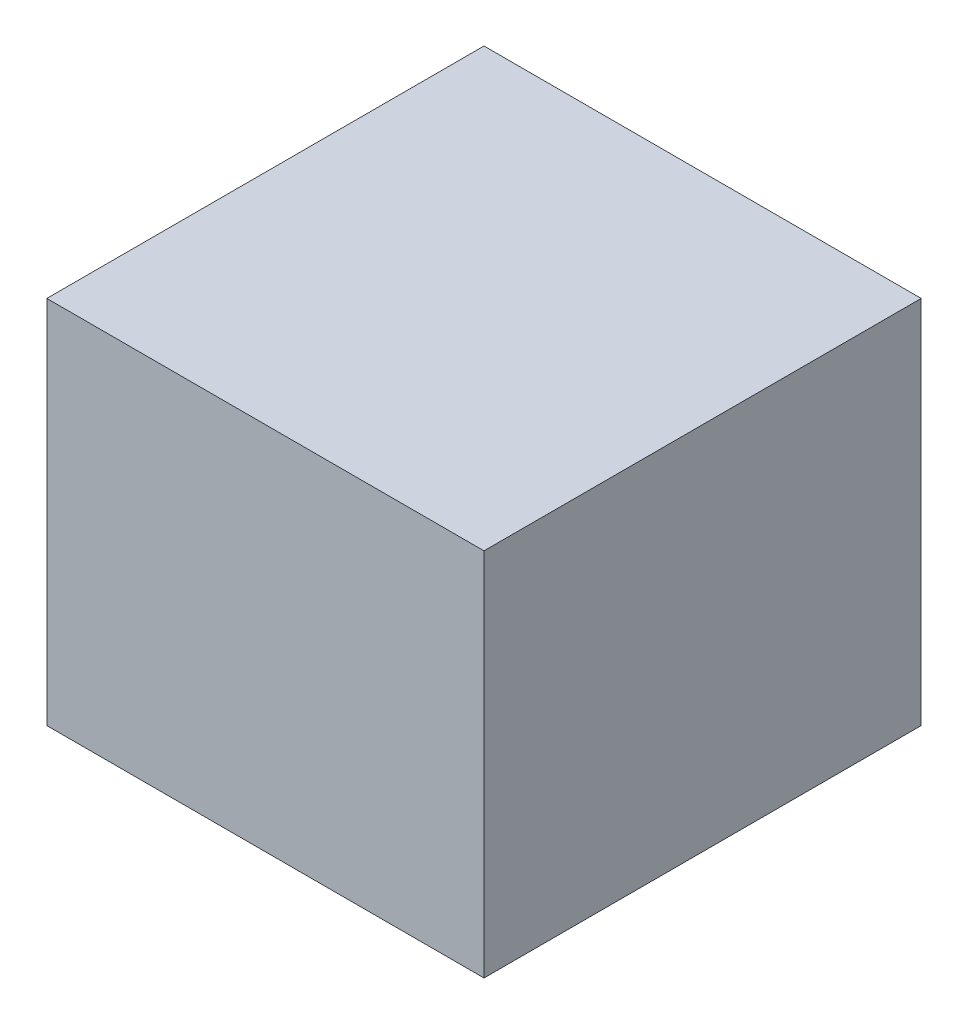
ISO-10303-21;
HEADER;
FILE_DESCRIPTION(('STEP AP214'),'2;1');
FILE_NAME('part.step','',(''),(''),'','','');
FILE_SCHEMA(('AUTOMOTIVE_DESIGN { 1 0 10303 214 1 1 1 1 }'));
ENDSEC;
DATA;
#1=APPLICATION_CONTEXT('core data for automotive mechanical design processes');
#2=APPLICATION_PROTOCOL_DEFINITION('international standard','automotive_design',2000,#1);
#3=PRODUCT_CONTEXT('',#1,'mechanical');
#4=PRODUCT('Part','Part','',(#3));
#5=PRODUCT_RELATED_PRODUCT_CATEGORY('part','',(#4));
#6=PRODUCT_DEFINITION_FORMATION('','',#4);
#7=PRODUCT_DEFINITION_CONTEXT('part definition',#1,'design');
#8=PRODUCT_DEFINITION('design','',#6,#7);
#9=PRODUCT_DEFINITION_SHAPE('','',#8);
#10=(LENGTH_UNIT() NAMED_UNIT(*) SI_UNIT(.MILLI.,.METRE.));
#11=(NAMED_UNIT(*) PLANE_ANGLE_UNIT() SI_UNIT($,.RADIAN.));
#12=(NAMED_UNIT(*) SI_UNIT($,.STERADIAN.) SOLID_ANGLE_UNIT());
#13=UNCERTAINTY_MEASURE_WITH_UNIT(LENGTH_MEASURE(1.E-05),#10,'distance_accuracy_value','');
#14=(GEOMETRIC_REPRESENTATION_CONTEXT(3) GLOBAL_UNCERTAINTY_ASSIGNED_CONTEXT((#13)) GLOBAL_UNIT_ASSIGNED_CONTEXT((#10,
#11,#12)) REPRESENTATION_CONTEXT('',''));
#15=CARTESIAN_POINT('',(0.,0.,0.));
#16=DIRECTION('',(0.,0.,1.));
#17=DIRECTION('',(1.,0.,0.));
#18=AXIS2_PLACEMENT_3D('',#15,#16,#17);
#19=CARTESIAN_POINT('',(-20.477519379845,279.4,-155.501162790698));
#20=DIRECTION('',(1.,0.,0.));
#21=DIRECTION('',(0.,0.,-1.));
#22=AXIS2_PLACEMENT_3D('',#19,#20,#21);
#23=PLANE('',#22);
#24=DIRECTION('',(0.,0.,1.));
#25=VECTOR('',#24,1.);
#26=CARTESIAN_POINT('',(-20.477519379845,0.,-155.501162790698));
#27=LINE('',#26,#25);
#28=CARTESIAN_POINT('',(-20.477519379845,0.,-155.501162790698));
#29=VERTEX_POINT('',#28);
#30=CARTESIAN_POINT('',(-20.477519379845,0.,174.698837209302));
#31=VERTEX_POINT('',#30);
#32=EDGE_CURVE('E96',#29,#31,#27,.T.);
#33=ORIENTED_EDGE('',*,*,#32,.T.);
#34=DIRECTION('',(0.,-1.,0.));
#35=VECTOR('',#34,1.);
#36=CARTESIAN_POINT('',(-20.477519379845,279.4,174.698837209302));
#37=LINE('',#36,#35);
#38=CARTESIAN_POINT('',(-20.477519379845,279.4,174.698837209302));
#39=VERTEX_POINT('',#38);
#40=EDGE_CURVE('E11',#39,#31,#37,.T.);
#41=ORIENTED_EDGE('',*,*,#40,.F.);
#42=DIRECTION('',(0.,0.,1.));
#43=VECTOR('',#42,1.);
#44=CARTESIAN_POINT('',(-20.477519379845,279.4,-155.501162790698));
#45=LINE('',#44,#43);
#46=CARTESIAN_POINT('',(-20.477519379845,279.4,-155.501162790698));
#47=VERTEX_POINT('',#46);
#48=EDGE_CURVE('E84',#47,#39,#45,.T.);
#49=ORIENTED_EDGE('',*,*,#48,.F.);
#50=DIRECTION('',(0.,-1.,0.));
#51=VECTOR('',#50,1.);
#52=CARTESIAN_POINT('',(-20.477519379845,279.4,-155.501162790698));
#53=LINE('',#52,#51);
#54=EDGE_CURVE('E92',#47,#29,#53,.T.);
#55=ORIENTED_EDGE('',*,*,#54,.T.);
#56=EDGE_LOOP('',(#33,#41,#49,#55));
#57=FACE_BOUND('',#56,.T.);
#58=ADVANCED_FACE('F33',(#57),#23,.F.);
#59=CARTESIAN_POINT('',(-20.477519379845,279.4,174.698837209302));
#60=DIRECTION('',(0.,0.,-1.));
#61=DIRECTION('',(-1.,0.,0.));
#62=AXIS2_PLACEMENT_3D('',#59,#60,#61);
#63=PLANE('',#62);
#64=DIRECTION('',(1.,0.,0.));
#65=VECTOR('',#64,1.);
#66=CARTESIAN_POINT('',(-20.477519379845,0.,174.698837209302));
#67=LINE('',#66,#65);
#68=CARTESIAN_POINT('',(309.722480620155,0.,174.698837209302));
#69=VERTEX_POINT('',#68);
#70=EDGE_CURVE('E88',#31,#69,#67,.T.);
#71=ORIENTED_EDGE('',*,*,#70,.T.);
#72=DIRECTION('',(0.,-1.,0.));
#73=VECTOR('',#72,1.);
#74=CARTESIAN_POINT('',(309.722480620155,279.4,174.698837209302));
#75=LINE('',#74,#73);
#76=CARTESIAN_POINT('',(309.722480620155,279.4,174.698837209302));
#77=VERTEX_POINT('',#76);
#78=EDGE_CURVE('E41',#77,#69,#75,.T.);
#79=ORIENTED_EDGE('',*,*,#78,.F.);
#80=DIRECTION('',(1.,0.,0.));
#81=VECTOR('',#80,1.);
#82=CARTESIAN_POINT('',(-20.477519379845,279.4,174.698837209302));
#83=LINE('',#82,#81);
#84=EDGE_CURVE('E79',#39,#77,#83,.T.);
#85=ORIENTED_EDGE('',*,*,#84,.F.);
#86=ORIENTED_EDGE('',*,*,#40,.T.);
#87=EDGE_LOOP('',(#71,#79,#85,#86));
#88=FACE_BOUND('',#87,.T.);
#89=ADVANCED_FACE('F87',(#88),#63,.F.);
#90=CARTESIAN_POINT('',(309.722480620155,279.4,-155.501162790698));
#91=DIRECTION('',(-1.,0.,0.));
#92=DIRECTION('',(0.,0.,1.));
#93=AXIS2_PLACEMENT_3D('',#90,#91,#92);
#94=PLANE('',#93);
#95=DIRECTION('',(0.,0.,-1.));
#96=VECTOR('',#95,1.);
#97=CARTESIAN_POINT('',(309.722480620155,0.,-155.501162790698));
#98=LINE('',#97,#96);
#99=CARTESIAN_POINT('',(309.722480620155,0.,-155.501162790698));
#100=VERTEX_POINT('',#99);
#101=EDGE_CURVE('E66',#69,#100,#98,.T.);
#102=ORIENTED_EDGE('',*,*,#101,.T.);
#103=DIRECTION('',(0.,-1.,0.));
#104=VECTOR('',#103,1.);
#105=CARTESIAN_POINT('',(309.722480620155,279.4,-155.501162790698));
#106=LINE('',#105,#104);
#107=CARTESIAN_POINT('',(309.722480620155,279.4,-155.501162790698));
#108=VERTEX_POINT('',#107);
#109=EDGE_CURVE('E89',#108,#100,#106,.T.);
#110=ORIENTED_EDGE('',*,*,#109,.F.);
#111=DIRECTION('',(0.,0.,-1.));
#112=VECTOR('',#111,1.);
#113=CARTESIAN_POINT('',(309.722480620155,279.4,-155.501162790698));
#114=LINE('',#113,#112);
#115=EDGE_CURVE('E82',#77,#108,#114,.T.);
#116=ORIENTED_EDGE('',*,*,#115,.F.);
#117=ORIENTED_EDGE('',*,*,#78,.T.);
#118=EDGE_LOOP('',(#102,#110,#116,#117));
#119=FACE_BOUND('',#118,.T.);
#120=ADVANCED_FACE('F90',(#119),#94,.F.);
#121=CARTESIAN_POINT('',(-20.477519379845,279.4,-155.501162790698));
#122=DIRECTION('',(0.,0.,1.));
#123=DIRECTION('',(1.,0.,0.));
#124=AXIS2_PLACEMENT_3D('',#121,#122,#123);
#125=PLANE('',#124);
#126=DIRECTION('',(-1.,0.,0.));
#127=VECTOR('',#126,1.);
#128=CARTESIAN_POINT('',(-20.477519379845,0.,-155.501162790698));
#129=LINE('',#128,#127);
#130=EDGE_CURVE('E72',#100,#29,#129,.T.);
#131=ORIENTED_EDGE('',*,*,#130,.T.);
#132=ORIENTED_EDGE('',*,*,#54,.F.);
#133=DIRECTION('',(-1.,0.,0.));
#134=VECTOR('',#133,1.);
#135=CARTESIAN_POINT('',(-20.477519379845,279.4,-155.501162790698));
#136=LINE('',#135,#134);
#137=EDGE_CURVE('E49',#108,#47,#136,.T.);
#138=ORIENTED_EDGE('',*,*,#137,.F.);
#139=ORIENTED_EDGE('',*,*,#109,.T.);
#140=EDGE_LOOP('',(#131,#132,#138,#139));
#141=FACE_BOUND('',#140,.T.);
#142=ADVANCED_FACE('F103',(#141),#125,.F.);
#143=CARTESIAN_POINT('',(0.,279.4,0.));
#144=DIRECTION('',(0.,1.,0.));
#145=DIRECTION('',(0.,0.,1.));
#146=AXIS2_PLACEMENT_3D('',#143,#144,#145);
#147=PLANE('',#146);
#148=ORIENTED_EDGE('',*,*,#48,.T.);
#149=ORIENTED_EDGE('',*,*,#84,.T.);
#150=ORIENTED_EDGE('',*,*,#115,.T.);
#151=ORIENTED_EDGE('',*,*,#137,.T.);
#152=EDGE_LOOP('',(#148,#149,#150,#151));
#153=FACE_BOUND('',#152,.T.);
#154=ADVANCED_FACE('F80',(#153),#147,.T.);
#155=CARTESIAN_POINT('',(0.,0.,0.));
#156=DIRECTION('',(0.,1.,0.));
#157=DIRECTION('',(0.,0.,1.));
#158=AXIS2_PLACEMENT_3D('',#155,#156,#157);
#159=PLANE('',#158);
#160=ORIENTED_EDGE('',*,*,#32,.F.);
#161=ORIENTED_EDGE('',*,*,#130,.F.);
#162=ORIENTED_EDGE('',*,*,#101,.F.);
#163=ORIENTED_EDGE('',*,*,#70,.F.);
#164=EDGE_LOOP('',(#160,#161,#162,#163));
#165=FACE_BOUND('',#164,.T.);
#166=ADVANCED_FACE('F106',(#165),#159,.F.);
#167=CLOSED_SHELL('',(#58,#89,#120,#142,#154,#166));
#168=MANIFOLD_SOLID_BREP('B2',#167);
#169=ADVANCED_BREP_SHAPE_REPRESENTATION('',(#18,#168),#14);
#170=SHAPE_DEFINITION_REPRESENTATION(#9,#169);
ENDSEC;
END-ISO-10303-21;
